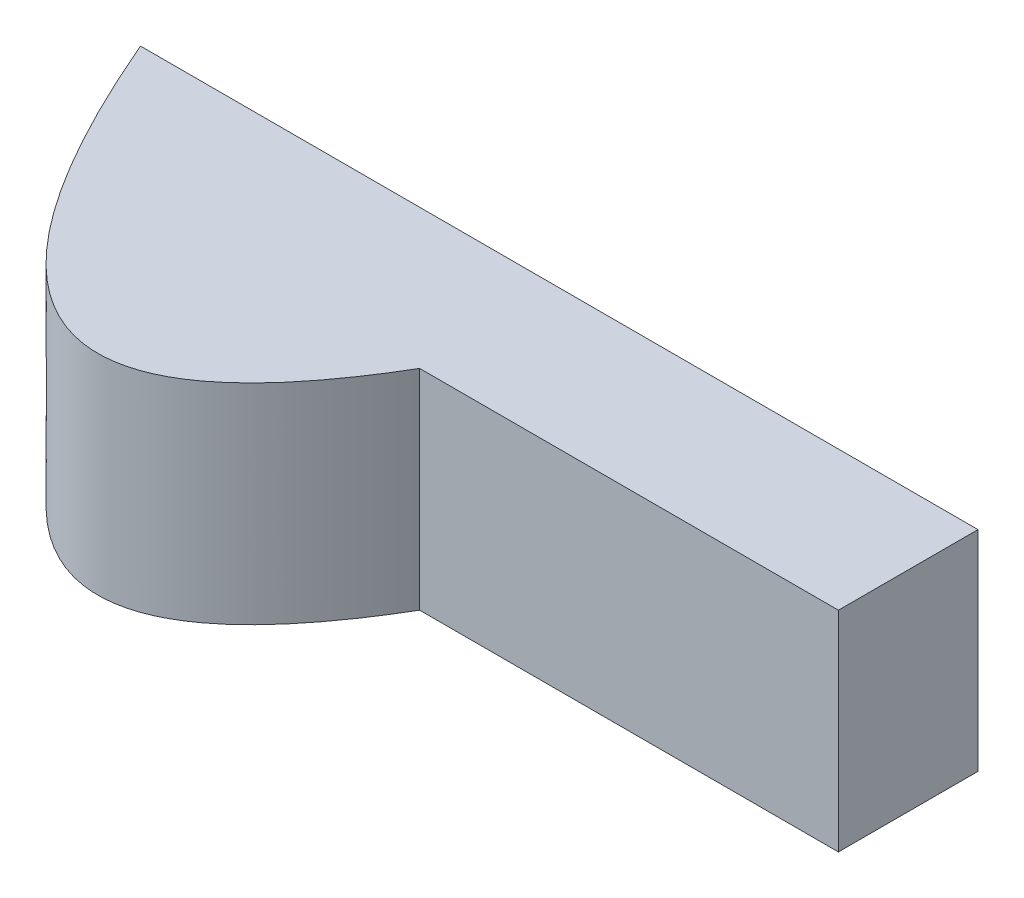
ISO-10303-21;
HEADER;
FILE_DESCRIPTION(('STEP AP214'),'2;1');
FILE_NAME('part.step','',(''),(''),'','','');
FILE_SCHEMA(('AUTOMOTIVE_DESIGN { 1 0 10303 214 1 1 1 1 }'));
ENDSEC;
DATA;
#1=APPLICATION_CONTEXT('core data for automotive mechanical design processes');
#2=APPLICATION_PROTOCOL_DEFINITION('international standard','automotive_design',2000,#1);
#3=PRODUCT_CONTEXT('',#1,'mechanical');
#4=PRODUCT('Part','Part','',(#3));
#5=PRODUCT_RELATED_PRODUCT_CATEGORY('part','',(#4));
#6=PRODUCT_DEFINITION_FORMATION('','',#4);
#7=PRODUCT_DEFINITION_CONTEXT('part definition',#1,'design');
#8=PRODUCT_DEFINITION('design','',#6,#7);
#9=PRODUCT_DEFINITION_SHAPE('','',#8);
#10=(LENGTH_UNIT() NAMED_UNIT(*) SI_UNIT(.MILLI.,.METRE.));
#11=(NAMED_UNIT(*) PLANE_ANGLE_UNIT() SI_UNIT($,.RADIAN.));
#12=(NAMED_UNIT(*) SI_UNIT($,.STERADIAN.) SOLID_ANGLE_UNIT());
#13=UNCERTAINTY_MEASURE_WITH_UNIT(LENGTH_MEASURE(1.E-05),#10,'distance_accuracy_value','');
#14=(GEOMETRIC_REPRESENTATION_CONTEXT(3) GLOBAL_UNCERTAINTY_ASSIGNED_CONTEXT((#13)) GLOBAL_UNIT_ASSIGNED_CONTEXT((#10,
#11,#12)) REPRESENTATION_CONTEXT('',''));
#15=CARTESIAN_POINT('',(0.,0.,0.));
#16=DIRECTION('',(0.,0.,1.));
#17=DIRECTION('',(1.,0.,0.));
#18=AXIS2_PLACEMENT_3D('',#15,#16,#17);
#19=CARTESIAN_POINT('',(-120.,30.,-70.));
#20=CARTESIAN_POINT('',(-89.7131671713932,30.,0.733691908096874));
#21=CARTESIAN_POINT('',(-60.,30.,-50.));
#22=B_SPLINE_CURVE_WITH_KNOTS('',2,(#19,#20,#21),.UNSPECIFIED.,.F.,.F.,(3,3),(0.,1.),.UNSPECIFIED.);
#23=DIRECTION('',(0.,-1.,0.));
#24=VECTOR('',#23,1.);
#25=SURFACE_OF_LINEAR_EXTRUSION('',#22,#24);
#26=CARTESIAN_POINT('',(-120.,0.,-70.));
#27=CARTESIAN_POINT('',(-89.7131671713932,0.,0.733691908096874));
#28=CARTESIAN_POINT('',(-60.,0.,-50.));
#29=B_SPLINE_CURVE_WITH_KNOTS('',2,(#26,#27,#28),.UNSPECIFIED.,.F.,.F.,(3,3),(0.,1.),.UNSPECIFIED.);
#30=CARTESIAN_POINT('',(-120.,0.,-70.));
#31=VERTEX_POINT('',#30);
#32=CARTESIAN_POINT('',(-60.,0.,-50.));
#33=VERTEX_POINT('',#32);
#34=EDGE_CURVE('E168',#31,#33,#29,.T.);
#35=ORIENTED_EDGE('',*,*,#34,.T.);
#36=DIRECTION('',(0.,-1.,0.));
#37=VECTOR('',#36,1.);
#38=CARTESIAN_POINT('',(-60.,30.,-50.));
#39=LINE('',#38,#37);
#40=CARTESIAN_POINT('',(-60.,30.,-50.));
#41=VERTEX_POINT('',#40);
#42=EDGE_CURVE('E11',#41,#33,#39,.T.);
#43=ORIENTED_EDGE('',*,*,#42,.F.);
#44=CARTESIAN_POINT('',(-120.,30.,-70.));
#45=VERTEX_POINT('',#44);
#46=EDGE_CURVE('E95',#45,#41,#22,.T.);
#47=ORIENTED_EDGE('',*,*,#46,.F.);
#48=DIRECTION('',(0.,-1.,0.));
#49=VECTOR('',#48,1.);
#50=CARTESIAN_POINT('',(-120.,30.,-70.));
#51=LINE('',#50,#49);
#52=EDGE_CURVE('E70',#45,#31,#51,.T.);
#53=ORIENTED_EDGE('',*,*,#52,.T.);
#54=EDGE_LOOP('',(#35,#43,#47,#53));
#55=FACE_BOUND('',#54,.T.);
#56=ADVANCED_FACE('F41',(#55),#25,.F.);
#57=CARTESIAN_POINT('',(0.,30.,-49.9999999999999));
#58=DIRECTION('',(0.,0.,1.));
#59=DIRECTION('',(1.,0.,0.));
#60=AXIS2_PLACEMENT_3D('',#57,#58,#59);
#61=PLANE('',#60);
#62=DIRECTION('',(-1.,0.,0.));
#63=VECTOR('',#62,1.);
#64=CARTESIAN_POINT('',(0.,0.,-49.9999999999999));
#65=LINE('',#64,#63);
#66=CARTESIAN_POINT('',(0.,0.,-49.9999999999999));
#67=VERTEX_POINT('',#66);
#68=EDGE_CURVE('E164',#67,#33,#65,.T.);
#69=ORIENTED_EDGE('',*,*,#68,.F.);
#70=DIRECTION('',(0.,-1.,0.));
#71=VECTOR('',#70,1.);
#72=CARTESIAN_POINT('',(0.,30.,-49.9999999999999));
#73=LINE('',#72,#71);
#74=CARTESIAN_POINT('',(0.,30.,-49.9999999999999));
#75=VERTEX_POINT('',#74);
#76=EDGE_CURVE('E53',#75,#67,#73,.T.);
#77=ORIENTED_EDGE('',*,*,#76,.F.);
#78=DIRECTION('',(-1.,0.,0.));
#79=VECTOR('',#78,1.);
#80=CARTESIAN_POINT('',(0.,30.,-49.9999999999999));
#81=LINE('',#80,#79);
#82=EDGE_CURVE('E183',#75,#41,#81,.T.);
#83=ORIENTED_EDGE('',*,*,#82,.T.);
#84=ORIENTED_EDGE('',*,*,#42,.T.);
#85=EDGE_LOOP('',(#69,#77,#83,#84));
#86=FACE_BOUND('',#85,.T.);
#87=ADVANCED_FACE('F282',(#86),#61,.T.);
#88=CARTESIAN_POINT('',(0.,30.,0.));
#89=DIRECTION('',(1.,0.,0.));
#90=DIRECTION('',(0.,0.,-1.));
#91=AXIS2_PLACEMENT_3D('',#88,#89,#90);
#92=PLANE('',#91);
#93=DIRECTION('',(0.,0.,1.));
#94=VECTOR('',#93,1.);
#95=CARTESIAN_POINT('',(0.,0.,0.));
#96=LINE('',#95,#94);
#97=CARTESIAN_POINT('',(0.,0.,-70.));
#98=VERTEX_POINT('',#97);
#99=EDGE_CURVE('E160',#98,#67,#96,.T.);
#100=ORIENTED_EDGE('',*,*,#99,.F.);
#101=DIRECTION('',(0.,-1.,0.));
#102=VECTOR('',#101,1.);
#103=CARTESIAN_POINT('',(0.,30.,-70.));
#104=LINE('',#103,#102);
#105=CARTESIAN_POINT('',(0.,30.,-70.));
#106=VERTEX_POINT('',#105);
#107=EDGE_CURVE('E150',#106,#98,#104,.T.);
#108=ORIENTED_EDGE('',*,*,#107,.F.);
#109=DIRECTION('',(0.,0.,1.));
#110=VECTOR('',#109,1.);
#111=CARTESIAN_POINT('',(0.,30.,0.));
#112=LINE('',#111,#110);
#113=EDGE_CURVE('E179',#106,#75,#112,.T.);
#114=ORIENTED_EDGE('',*,*,#113,.T.);
#115=ORIENTED_EDGE('',*,*,#76,.T.);
#116=EDGE_LOOP('',(#100,#108,#114,#115));
#117=FACE_BOUND('',#116,.T.);
#118=ADVANCED_FACE('F286',(#117),#92,.T.);
#119=CARTESIAN_POINT('',(0.,30.,-70.));
#120=DIRECTION('',(0.,0.,-1.));
#121=DIRECTION('',(-1.,0.,0.));
#122=AXIS2_PLACEMENT_3D('',#119,#120,#121);
#123=PLANE('',#122);
#124=DIRECTION('',(1.,0.,0.));
#125=VECTOR('',#124,1.);
#126=CARTESIAN_POINT('',(0.,0.,-70.));
#127=LINE('',#126,#125);
#128=EDGE_CURVE('E156',#31,#98,#127,.T.);
#129=ORIENTED_EDGE('',*,*,#128,.F.);
#130=ORIENTED_EDGE('',*,*,#52,.F.);
#131=DIRECTION('',(1.,0.,0.));
#132=VECTOR('',#131,1.);
#133=CARTESIAN_POINT('',(0.,30.,-70.));
#134=LINE('',#133,#132);
#135=EDGE_CURVE('E155',#45,#106,#134,.T.);
#136=ORIENTED_EDGE('',*,*,#135,.T.);
#137=ORIENTED_EDGE('',*,*,#107,.T.);
#138=EDGE_LOOP('',(#129,#130,#136,#137));
#139=FACE_BOUND('',#138,.T.);
#140=ADVANCED_FACE('F292',(#139),#123,.T.);
#141=CARTESIAN_POINT('',(0.,30.,0.));
#142=DIRECTION('',(0.,1.,0.));
#143=DIRECTION('',(0.,0.,1.));
#144=AXIS2_PLACEMENT_3D('',#141,#142,#143);
#145=PLANE('',#144);
#146=ORIENTED_EDGE('',*,*,#46,.T.);
#147=ORIENTED_EDGE('',*,*,#82,.F.);
#148=ORIENTED_EDGE('',*,*,#113,.F.);
#149=ORIENTED_EDGE('',*,*,#135,.F.);
#150=EDGE_LOOP('',(#146,#147,#148,#149));
#151=FACE_BOUND('',#150,.T.);
#152=ADVANCED_FACE('F221',(#151),#145,.T.);
#153=CARTESIAN_POINT('',(0.,0.,0.));
#154=DIRECTION('',(0.,1.,0.));
#155=DIRECTION('',(0.,0.,1.));
#156=AXIS2_PLACEMENT_3D('',#153,#154,#155);
#157=PLANE('',#156);
#158=DIRECTION('',(-1.,0.,0.));
#159=VECTOR('',#158,1.);
#160=CARTESIAN_POINT('',(-2.50000000000005,0.,-67.5));
#161=LINE('',#160,#159);
#162=CARTESIAN_POINT('',(-2.50000000000005,0.,-67.5));
#163=VERTEX_POINT('',#162);
#164=CARTESIAN_POINT('',(-116.177064023201,0.,-67.5000000000004));
#165=VERTEX_POINT('',#164);
#166=EDGE_CURVE('E134',#163,#165,#161,.T.);
#167=ORIENTED_EDGE('',*,*,#166,.T.);
#168=CARTESIAN_POINT('',(-61.4436088463232,0.,-52.5000000000001));
#169=CARTESIAN_POINT('',(-62.3010242002767,0.,-50.9926209606455));
#170=CARTESIAN_POINT('',(-63.1908031254853,0.,-49.5057609931996));
#171=CARTESIAN_POINT('',(-64.5879981872776,0.,-47.3151140501925));
#172=CARTESIAN_POINT('',(-65.0642068309095,0.,-46.5915409766499));
#173=CARTESIAN_POINT('',(-66.0408478634344,0.,-45.1597531090015));
#174=CARTESIAN_POINT('',(-66.5418494593214,0.,-44.4507627901928));
#175=CARTESIAN_POINT('',(-68.0822680783864,0.,-42.3578399207545));
#176=CARTESIAN_POINT('',(-69.1581903029301,0.,-41.0072334673137));
#177=CARTESIAN_POINT('',(-71.4477303670411,0.,-38.4316240146332));
#178=CARTESIAN_POINT('',(-72.6601479863131,0.,-37.2055261960993));
#179=CARTESIAN_POINT('',(-74.6385888865062,0.,-35.5121593438901));
#180=CARTESIAN_POINT('',(-75.3273415070287,0.,-34.9712728801731));
#181=CARTESIAN_POINT('',(-76.7467376470438,0.,-33.9746945531045));
#182=CARTESIAN_POINT('',(-77.4798890649531,0.,-33.5164250795655));
#183=CARTESIAN_POINT('',(-78.6244385826102,0.,-32.9055036891836));
#184=CARTESIAN_POINT('',(-79.0134637113756,0.,-32.7146755867483));
#185=CARTESIAN_POINT('',(-79.8087550241338,0.,-32.3624387077222));
#186=CARTESIAN_POINT('',(-80.2169922335614,0.,-32.200384688108));
#187=CARTESIAN_POINT('',(-81.455315589224,0.,-31.7709522448764));
#188=CARTESIAN_POINT('',(-82.2964471090301,0.,-31.5603043671231));
#189=CARTESIAN_POINT('',(-83.585082185935,0.,-31.3750927661425));
#190=CARTESIAN_POINT('',(-84.0191222857126,0.,-31.3351753478854));
#191=CARTESIAN_POINT('',(-84.8968277364699,0.,-31.3020629628697));
#192=CARTESIAN_POINT('',(-85.3333005800427,0.,-31.3091963093695));
#193=CARTESIAN_POINT('',(-86.6319794891729,0.,-31.3985552152406));
#194=CARTESIAN_POINT('',(-87.4852214860535,0.,-31.5486641418284));
#195=CARTESIAN_POINT('',(-88.748175399052,0.,-31.8958693959423));
#196=CARTESIAN_POINT('',(-89.1663921321508,0.,-32.0322331402931));
#197=CARTESIAN_POINT('',(-89.9803534008524,0.,-32.3359415031745));
#198=CARTESIAN_POINT('',(-90.3785248730164,0.,-32.5038769681127));
#199=CARTESIAN_POINT('',(-91.5500790719983,0.,-33.0495976514495));
#200=CARTESIAN_POINT('',(-92.3006623995121,0.,-33.4690035819629));
#201=CARTESIAN_POINT('',(-93.7542637647784,0.,-34.3946467320252));
#202=CARTESIAN_POINT('',(-94.4584820858045,0.,-34.9020456401746));
#203=CARTESIAN_POINT('',(-95.8226982307764,0.,-35.9831348470774));
#204=CARTESIAN_POINT('',(-96.4773176914296,0.,-36.55230174447));
#205=CARTESIAN_POINT('',(-97.7434622983427,0.,-37.735507144319));
#206=CARTESIAN_POINT('',(-98.3549180146349,0.,-38.3496179401818));
#207=CARTESIAN_POINT('',(-99.5426676728677,0.,-39.6144514440039));
#208=CARTESIAN_POINT('',(-100.120108367071,0.,-40.266686798251));
#209=CARTESIAN_POINT('',(-101.795600134389,0.,-42.2539255780658));
#210=CARTESIAN_POINT('',(-102.840479709536,0.,-43.6213875774097));
#211=CARTESIAN_POINT('',(-104.830277833299,0.,-46.4154110240916));
#212=CARTESIAN_POINT('',(-105.774709206246,0.,-47.842260501817));
#213=CARTESIAN_POINT('',(-108.49482280566,0.,-52.1897240763957));
#214=CARTESIAN_POINT('',(-110.159197746482,0.,-55.1761458121499));
#215=CARTESIAN_POINT('',(-113.298573184187,0.,-61.2609521705572));
#216=CARTESIAN_POINT('',(-114.771949278967,0.,-64.3602971801829));
#217=CARTESIAN_POINT('',(-116.177064023201,0.,-67.5000000000004));
#218=B_SPLINE_CURVE_WITH_KNOTS('',3,(#168,#169,#170,#171,#172,#173,#174,#175,#176,#177,#178,
#179,#180,#181,#182,#183,#184,#185,#186,#187,#188,#189,#190,#191,#192,#193,#194,#195,#196,#197,
#198,#199,#200,#201,#202,#203,#204,#205,#206,#207,#208,#209,#210,#211,#212,#213,#214,#215,#216,
#217),.UNSPECIFIED.,.F.,.F.,(4,2,2,2,2,2,2,2,2,2,2,2,2,2,2,2,2,2,2,2,2,2,2,2,4),(0.,
0.0624999999999994,0.0937499999999993,0.124999999999999,0.187499999999999,0.249999999999999,
0.281249999999999,0.312499999999999,0.328124999999999,0.343749999999998,0.374999999999998,
0.390624999999998,0.406249999999998,0.437499999999997,0.453124999999997,0.468749999999997,
0.499999999999997,0.531249999999997,0.562499999999997,0.593749999999997,0.624999999999997,
0.687499999999998,0.749999999999998,0.874999999999999,1.),.UNSPECIFIED.);
#219=CARTESIAN_POINT('',(-61.4436088463232,0.,-52.5000000000001));
#220=VERTEX_POINT('',#219);
#221=EDGE_CURVE('E123',#165,#220,#218,.F.);
#222=ORIENTED_EDGE('',*,*,#221,.T.);
#223=DIRECTION('',(1.,0.,0.));
#224=VECTOR('',#223,1.);
#225=CARTESIAN_POINT('',(-61.4436088463232,0.,-52.5000000000001));
#226=LINE('',#225,#224);
#227=CARTESIAN_POINT('',(-2.50000000000002,0.,-52.4999999999999));
#228=VERTEX_POINT('',#227);
#229=EDGE_CURVE('E137',#220,#228,#226,.T.);
#230=ORIENTED_EDGE('',*,*,#229,.T.);
#231=DIRECTION('',(0.,0.,-1.));
#232=VECTOR('',#231,1.);
#233=CARTESIAN_POINT('',(-2.50000000000002,0.,-52.4999999999999));
#234=LINE('',#233,#232);
#235=EDGE_CURVE('E61',#228,#163,#234,.T.);
#236=ORIENTED_EDGE('',*,*,#235,.T.);
#237=EDGE_LOOP('',(#167,#222,#230,#236));
#238=FACE_BOUND('',#237,.T.);
#239=ORIENTED_EDGE('',*,*,#34,.F.);
#240=ORIENTED_EDGE('',*,*,#128,.T.);
#241=ORIENTED_EDGE('',*,*,#99,.T.);
#242=ORIENTED_EDGE('',*,*,#68,.T.);
#243=EDGE_LOOP('',(#239,#240,#241,#242));
#244=FACE_BOUND('',#243,.T.);
#245=ADVANCED_FACE('F142',(#238,#244),#157,.F.);
#246=CARTESIAN_POINT('',(-116.177064023201,0.,-67.5000000000004));
#247=CARTESIAN_POINT('',(-114.771949278967,0.,-64.3602971801829));
#248=CARTESIAN_POINT('',(-113.298573184187,0.,-61.2609521705572));
#249=CARTESIAN_POINT('',(-110.159197746482,0.,-55.1761458121499));
#250=CARTESIAN_POINT('',(-108.49482280566,0.,-52.1897240763957));
#251=CARTESIAN_POINT('',(-105.774709206246,0.,-47.842260501817));
#252=CARTESIAN_POINT('',(-104.830277833299,0.,-46.4154110240916));
#253=CARTESIAN_POINT('',(-102.840479709536,0.,-43.6213875774097));
#254=CARTESIAN_POINT('',(-101.795600134389,0.,-42.2539255780658));
#255=CARTESIAN_POINT('',(-100.120108367071,0.,-40.266686798251));
#256=CARTESIAN_POINT('',(-99.5426676728677,0.,-39.6144514440039));
#257=CARTESIAN_POINT('',(-98.3549180146349,0.,-38.3496179401818));
#258=CARTESIAN_POINT('',(-97.7434622983427,0.,-37.735507144319));
#259=CARTESIAN_POINT('',(-96.4773176914296,0.,-36.55230174447));
#260=CARTESIAN_POINT('',(-95.8226982307764,0.,-35.9831348470774));
#261=CARTESIAN_POINT('',(-94.4584820858045,0.,-34.9020456401746));
#262=CARTESIAN_POINT('',(-93.7542637647784,0.,-34.3946467320252));
#263=CARTESIAN_POINT('',(-92.3006623995121,0.,-33.4690035819629));
#264=CARTESIAN_POINT('',(-91.5500790719983,0.,-33.0495976514495));
#265=CARTESIAN_POINT('',(-90.3785248730164,0.,-32.5038769681127));
#266=CARTESIAN_POINT('',(-89.9803534008524,0.,-32.3359415031745));
#267=CARTESIAN_POINT('',(-89.1663921321508,0.,-32.0322331402931));
#268=CARTESIAN_POINT('',(-88.748175399052,0.,-31.8958693959423));
#269=CARTESIAN_POINT('',(-87.4852214860535,0.,-31.5486641418284));
#270=CARTESIAN_POINT('',(-86.6319794891729,0.,-31.3985552152406));
#271=CARTESIAN_POINT('',(-85.3333005800427,0.,-31.3091963093695));
#272=CARTESIAN_POINT('',(-84.8968277364699,0.,-31.3020629628697));
#273=CARTESIAN_POINT('',(-84.0191222857126,0.,-31.3351753478854));
#274=CARTESIAN_POINT('',(-83.585082185935,0.,-31.3750927661425));
#275=CARTESIAN_POINT('',(-82.2964471090301,0.,-31.5603043671231));
#276=CARTESIAN_POINT('',(-81.455315589224,0.,-31.7709522448764));
#277=CARTESIAN_POINT('',(-80.2169922335614,0.,-32.200384688108));
#278=CARTESIAN_POINT('',(-79.8087550241338,0.,-32.3624387077222));
#279=CARTESIAN_POINT('',(-79.0134637113756,0.,-32.7146755867483));
#280=CARTESIAN_POINT('',(-78.6244385826102,0.,-32.9055036891836));
#281=CARTESIAN_POINT('',(-77.4798890649531,0.,-33.5164250795655));
#282=CARTESIAN_POINT('',(-76.7467376470438,0.,-33.9746945531045));
#283=CARTESIAN_POINT('',(-75.3273415070287,0.,-34.9712728801731));
#284=CARTESIAN_POINT('',(-74.6385888865062,0.,-35.5121593438901));
#285=CARTESIAN_POINT('',(-72.6601479863131,0.,-37.2055261960993));
#286=CARTESIAN_POINT('',(-71.4477303670411,0.,-38.4316240146332));
#287=CARTESIAN_POINT('',(-69.1581903029301,0.,-41.0072334673137));
#288=CARTESIAN_POINT('',(-68.0822680783864,0.,-42.3578399207545));
#289=CARTESIAN_POINT('',(-66.5418494593214,0.,-44.4507627901928));
#290=CARTESIAN_POINT('',(-66.0408478634344,0.,-45.1597531090015));
#291=CARTESIAN_POINT('',(-65.0642068309095,0.,-46.5915409766499));
#292=CARTESIAN_POINT('',(-64.5879981872776,0.,-47.3151140501925));
#293=CARTESIAN_POINT('',(-63.1908031254853,0.,-49.5057609931996));
#294=CARTESIAN_POINT('',(-62.3010242002767,0.,-50.9926209606455));
#295=CARTESIAN_POINT('',(-61.4436088463232,0.,-52.5000000000001));
#296=B_SPLINE_CURVE_WITH_KNOTS('',3,(#246,#247,#248,#249,#250,#251,#252,#253,#254,#255,#256,
#257,#258,#259,#260,#261,#262,#263,#264,#265,#266,#267,#268,#269,#270,#271,#272,#273,#274,#275,
#276,#277,#278,#279,#280,#281,#282,#283,#284,#285,#286,#287,#288,#289,#290,#291,#292,#293,#294,
#295),.UNSPECIFIED.,.F.,.F.,(4,2,2,2,2,2,2,2,2,2,2,2,2,2,2,2,2,2,2,2,2,2,2,2,4),(0.,
0.125000000000001,0.250000000000002,0.312500000000002,0.375000000000003,0.406250000000003,
0.437500000000003,0.468750000000003,0.500000000000003,0.531250000000003,0.546875000000003,
0.562500000000003,0.593750000000002,0.609375000000002,0.625000000000002,0.656250000000002,
0.671875000000001,0.687500000000001,0.718750000000001,0.750000000000001,0.812500000000001,
0.875000000000001,0.906250000000001,0.937500000000001,1.),.UNSPECIFIED.);
#297=DIRECTION('',(0.,1.,0.));
#298=VECTOR('',#297,1.);
#299=SURFACE_OF_LINEAR_EXTRUSION('',#296,#298);
#300=CARTESIAN_POINT('',(-116.177064023201,27.5,-67.5000000000004));
#301=CARTESIAN_POINT('',(-114.771949278967,27.5,-64.3602971801829));
#302=CARTESIAN_POINT('',(-113.298573184187,27.5,-61.2609521705572));
#303=CARTESIAN_POINT('',(-110.159197746482,27.5,-55.1761458121499));
#304=CARTESIAN_POINT('',(-108.49482280566,27.5,-52.1897240763957));
#305=CARTESIAN_POINT('',(-105.774709206246,27.5,-47.842260501817));
#306=CARTESIAN_POINT('',(-104.830277833299,27.5,-46.4154110240916));
#307=CARTESIAN_POINT('',(-102.840479709536,27.5,-43.6213875774097));
#308=CARTESIAN_POINT('',(-101.795600134389,27.5,-42.2539255780658));
#309=CARTESIAN_POINT('',(-100.120108367071,27.5,-40.266686798251));
#310=CARTESIAN_POINT('',(-99.5426676728677,27.5,-39.6144514440039));
#311=CARTESIAN_POINT('',(-98.3549180146349,27.5,-38.3496179401818));
#312=CARTESIAN_POINT('',(-97.7434622983427,27.5,-37.735507144319));
#313=CARTESIAN_POINT('',(-96.4773176914296,27.5,-36.55230174447));
#314=CARTESIAN_POINT('',(-95.8226982307764,27.5,-35.9831348470774));
#315=CARTESIAN_POINT('',(-94.4584820858045,27.5,-34.9020456401746));
#316=CARTESIAN_POINT('',(-93.7542637647784,27.5,-34.3946467320252));
#317=CARTESIAN_POINT('',(-92.3006623995121,27.5,-33.4690035819629));
#318=CARTESIAN_POINT('',(-91.5500790719983,27.5,-33.0495976514495));
#319=CARTESIAN_POINT('',(-90.3785248730164,27.5,-32.5038769681127));
#320=CARTESIAN_POINT('',(-89.9803534008524,27.5,-32.3359415031745));
#321=CARTESIAN_POINT('',(-89.1663921321508,27.5,-32.0322331402931));
#322=CARTESIAN_POINT('',(-88.748175399052,27.5,-31.8958693959423));
#323=CARTESIAN_POINT('',(-87.4852214860535,27.5,-31.5486641418284));
#324=CARTESIAN_POINT('',(-86.6319794891729,27.5,-31.3985552152406));
#325=CARTESIAN_POINT('',(-85.3333005800427,27.5,-31.3091963093695));
#326=CARTESIAN_POINT('',(-84.8968277364699,27.5,-31.3020629628697));
#327=CARTESIAN_POINT('',(-84.0191222857126,27.5,-31.3351753478854));
#328=CARTESIAN_POINT('',(-83.585082185935,27.5,-31.3750927661425));
#329=CARTESIAN_POINT('',(-82.2964471090301,27.5,-31.5603043671231));
#330=CARTESIAN_POINT('',(-81.455315589224,27.5,-31.7709522448764));
#331=CARTESIAN_POINT('',(-80.2169922335614,27.5,-32.200384688108));
#332=CARTESIAN_POINT('',(-79.8087550241338,27.5,-32.3624387077222));
#333=CARTESIAN_POINT('',(-79.0134637113756,27.5,-32.7146755867483));
#334=CARTESIAN_POINT('',(-78.6244385826102,27.5,-32.9055036891836));
#335=CARTESIAN_POINT('',(-77.4798890649531,27.5,-33.5164250795655));
#336=CARTESIAN_POINT('',(-76.7467376470438,27.5,-33.9746945531045));
#337=CARTESIAN_POINT('',(-75.3273415070287,27.5,-34.9712728801731));
#338=CARTESIAN_POINT('',(-74.6385888865062,27.5,-35.5121593438901));
#339=CARTESIAN_POINT('',(-72.6601479863131,27.5,-37.2055261960993));
#340=CARTESIAN_POINT('',(-71.4477303670411,27.5,-38.4316240146332));
#341=CARTESIAN_POINT('',(-69.1581903029301,27.5,-41.0072334673137));
#342=CARTESIAN_POINT('',(-68.0822680783864,27.5,-42.3578399207545));
#343=CARTESIAN_POINT('',(-66.5418494593214,27.5,-44.4507627901928));
#344=CARTESIAN_POINT('',(-66.0408478634344,27.5,-45.1597531090015));
#345=CARTESIAN_POINT('',(-65.0642068309095,27.5,-46.5915409766499));
#346=CARTESIAN_POINT('',(-64.5879981872776,27.5,-47.3151140501925));
#347=CARTESIAN_POINT('',(-63.1908031254853,27.5,-49.5057609931996));
#348=CARTESIAN_POINT('',(-62.3010242002767,27.5,-50.9926209606455));
#349=CARTESIAN_POINT('',(-61.4436088463232,27.5,-52.5000000000001));
#350=B_SPLINE_CURVE_WITH_KNOTS('',3,(#300,#301,#302,#303,#304,#305,#306,#307,#308,#309,#310,
#311,#312,#313,#314,#315,#316,#317,#318,#319,#320,#321,#322,#323,#324,#325,#326,#327,#328,#329,
#330,#331,#332,#333,#334,#335,#336,#337,#338,#339,#340,#341,#342,#343,#344,#345,#346,#347,#348,
#349),.UNSPECIFIED.,.F.,.F.,(4,2,2,2,2,2,2,2,2,2,2,2,2,2,2,2,2,2,2,2,2,2,2,2,4),(0.,
0.125000000000001,0.250000000000002,0.312500000000002,0.375000000000003,0.406250000000003,
0.437500000000003,0.468750000000003,0.500000000000003,0.531250000000003,0.546875000000003,
0.562500000000003,0.593750000000002,0.609375000000002,0.625000000000002,0.656250000000002,
0.671875000000001,0.687500000000001,0.718750000000001,0.750000000000001,0.812500000000001,
0.875000000000001,0.906250000000001,0.937500000000001,1.),.UNSPECIFIED.);
#351=CARTESIAN_POINT('',(-116.177064023201,27.5,-67.5000000000004));
#352=VERTEX_POINT('',#351);
#353=CARTESIAN_POINT('',(-61.4436088463232,27.5,-52.5000000000001));
#354=VERTEX_POINT('',#353);
#355=EDGE_CURVE('E127',#352,#354,#350,.T.);
#356=ORIENTED_EDGE('',*,*,#355,.T.);
#357=DIRECTION('',(0.,1.,0.));
#358=VECTOR('',#357,1.);
#359=CARTESIAN_POINT('',(-61.4436088463232,0.,-52.5000000000001));
#360=LINE('',#359,#358);
#361=EDGE_CURVE('E119',#220,#354,#360,.T.);
#362=ORIENTED_EDGE('',*,*,#361,.F.);
#363=ORIENTED_EDGE('',*,*,#221,.F.);
#364=DIRECTION('',(0.,1.,0.));
#365=VECTOR('',#364,1.);
#366=CARTESIAN_POINT('',(-116.177064023201,0.,-67.5000000000004));
#367=LINE('',#366,#365);
#368=EDGE_CURVE('E173',#165,#352,#367,.T.);
#369=ORIENTED_EDGE('',*,*,#368,.T.);
#370=EDGE_LOOP('',(#356,#362,#363,#369));
#371=FACE_BOUND('',#370,.T.);
#372=ADVANCED_FACE('F121',(#371),#299,.F.);
#373=CARTESIAN_POINT('',(-2.50000000000005,0.,-67.5));
#374=DIRECTION('',(0.,0.,-1.));
#375=DIRECTION('',(-1.,0.,0.));
#376=AXIS2_PLACEMENT_3D('',#373,#374,#375);
#377=PLANE('',#376);
#378=DIRECTION('',(-1.,0.,0.));
#379=VECTOR('',#378,1.);
#380=CARTESIAN_POINT('',(-2.50000000000005,27.5,-67.5));
#381=LINE('',#380,#379);
#382=CARTESIAN_POINT('',(-2.50000000000005,27.5,-67.5));
#383=VERTEX_POINT('',#382);
#384=EDGE_CURVE('E146',#383,#352,#381,.T.);
#385=ORIENTED_EDGE('',*,*,#384,.T.);
#386=ORIENTED_EDGE('',*,*,#368,.F.);
#387=ORIENTED_EDGE('',*,*,#166,.F.);
#388=DIRECTION('',(0.,1.,0.));
#389=VECTOR('',#388,1.);
#390=CARTESIAN_POINT('',(-2.50000000000005,0.,-67.5));
#391=LINE('',#390,#389);
#392=EDGE_CURVE('E236',#163,#383,#391,.T.);
#393=ORIENTED_EDGE('',*,*,#392,.T.);
#394=EDGE_LOOP('',(#385,#386,#387,#393));
#395=FACE_BOUND('',#394,.T.);
#396=ADVANCED_FACE('F219',(#395),#377,.F.);
#397=CARTESIAN_POINT('',(-2.50000000000002,0.,-52.4999999999999));
#398=DIRECTION('',(1.,0.,0.));
#399=DIRECTION('',(0.,0.,-1.));
#400=AXIS2_PLACEMENT_3D('',#397,#398,#399);
#401=PLANE('',#400);
#402=DIRECTION('',(0.,0.,-1.));
#403=VECTOR('',#402,1.);
#404=CARTESIAN_POINT('',(-2.50000000000002,27.5,-52.4999999999999));
#405=LINE('',#404,#403);
#406=CARTESIAN_POINT('',(-2.50000000000002,27.5,-52.4999999999999));
#407=VERTEX_POINT('',#406);
#408=EDGE_CURVE('E199',#407,#383,#405,.T.);
#409=ORIENTED_EDGE('',*,*,#408,.T.);
#410=ORIENTED_EDGE('',*,*,#392,.F.);
#411=ORIENTED_EDGE('',*,*,#235,.F.);
#412=DIRECTION('',(0.,1.,0.));
#413=VECTOR('',#412,1.);
#414=CARTESIAN_POINT('',(-2.50000000000002,0.,-52.4999999999999));
#415=LINE('',#414,#413);
#416=EDGE_CURVE('E133',#228,#407,#415,.T.);
#417=ORIENTED_EDGE('',*,*,#416,.T.);
#418=EDGE_LOOP('',(#409,#410,#411,#417));
#419=FACE_BOUND('',#418,.T.);
#420=ADVANCED_FACE('F275',(#419),#401,.F.);
#421=CARTESIAN_POINT('',(-61.4436088463232,0.,-52.5000000000001));
#422=DIRECTION('',(0.,0.,1.));
#423=DIRECTION('',(1.,0.,0.));
#424=AXIS2_PLACEMENT_3D('',#421,#422,#423);
#425=PLANE('',#424);
#426=DIRECTION('',(1.,0.,0.));
#427=VECTOR('',#426,1.);
#428=CARTESIAN_POINT('',(-61.4436088463232,27.5,-52.5000000000001));
#429=LINE('',#428,#427);
#430=EDGE_CURVE('E196',#354,#407,#429,.T.);
#431=ORIENTED_EDGE('',*,*,#430,.T.);
#432=ORIENTED_EDGE('',*,*,#416,.F.);
#433=ORIENTED_EDGE('',*,*,#229,.F.);
#434=ORIENTED_EDGE('',*,*,#361,.T.);
#435=EDGE_LOOP('',(#431,#432,#433,#434));
#436=FACE_BOUND('',#435,.T.);
#437=ADVANCED_FACE('F138',(#436),#425,.F.);
#438=CARTESIAN_POINT('',(-93.0274630821454,27.5,-33.9318251569942));
#439=DIRECTION('',(0.,-1.,0.));
#440=DIRECTION('',(0.,0.,-1.));
#441=AXIS2_PLACEMENT_3D('',#438,#439,#440);
#442=PLANE('',#441);
#443=ORIENTED_EDGE('',*,*,#355,.F.);
#444=ORIENTED_EDGE('',*,*,#384,.F.);
#445=ORIENTED_EDGE('',*,*,#408,.F.);
#446=ORIENTED_EDGE('',*,*,#430,.F.);
#447=EDGE_LOOP('',(#443,#444,#445,#446));
#448=FACE_BOUND('',#447,.T.);
#449=ADVANCED_FACE('F265',(#448),#442,.T.);
#450=CLOSED_SHELL('',(#56,#87,#118,#140,#152,#245,#372,#396,#420,#437,#449));
#451=MANIFOLD_SOLID_BREP('B2',#450);
#452=ADVANCED_BREP_SHAPE_REPRESENTATION('',(#18,#451),#14);
#453=SHAPE_DEFINITION_REPRESENTATION(#9,#452);
ENDSEC;
END-ISO-10303-21;
